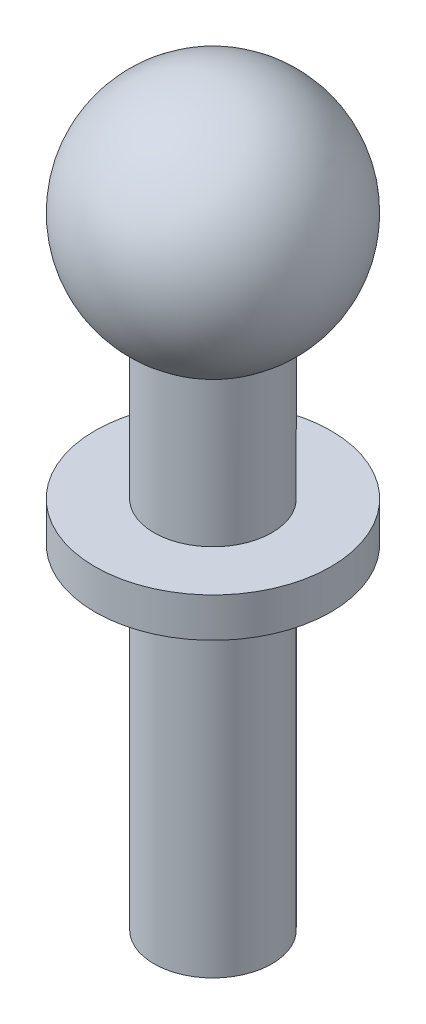
ISO-10303-21;
HEADER;
FILE_DESCRIPTION(('STEP AP214'),'2;1');
FILE_NAME('part.step','',(''),(''),'','','');
FILE_SCHEMA(('AUTOMOTIVE_DESIGN { 1 0 10303 214 1 1 1 1 }'));
ENDSEC;
DATA;
#1=APPLICATION_CONTEXT('core data for automotive mechanical design processes');
#2=APPLICATION_PROTOCOL_DEFINITION('international standard','automotive_design',2000,#1);
#3=PRODUCT_CONTEXT('',#1,'mechanical');
#4=PRODUCT('Part','Part','',(#3));
#5=PRODUCT_RELATED_PRODUCT_CATEGORY('part','',(#4));
#6=PRODUCT_DEFINITION_FORMATION('','',#4);
#7=PRODUCT_DEFINITION_CONTEXT('part definition',#1,'design');
#8=PRODUCT_DEFINITION('design','',#6,#7);
#9=PRODUCT_DEFINITION_SHAPE('','',#8);
#10=(LENGTH_UNIT() NAMED_UNIT(*) SI_UNIT(.MILLI.,.METRE.));
#11=(NAMED_UNIT(*) PLANE_ANGLE_UNIT() SI_UNIT($,.RADIAN.));
#12=(NAMED_UNIT(*) SI_UNIT($,.STERADIAN.) SOLID_ANGLE_UNIT());
#13=UNCERTAINTY_MEASURE_WITH_UNIT(LENGTH_MEASURE(1.E-05),#10,'distance_accuracy_value','');
#14=(GEOMETRIC_REPRESENTATION_CONTEXT(3) GLOBAL_UNCERTAINTY_ASSIGNED_CONTEXT((#13)) GLOBAL_UNIT_ASSIGNED_CONTEXT((#10,
#11,#12)) REPRESENTATION_CONTEXT('',''));
#15=CARTESIAN_POINT('',(0.,0.,0.));
#16=DIRECTION('',(0.,0.,1.));
#17=DIRECTION('',(1.,0.,0.));
#18=AXIS2_PLACEMENT_3D('',#15,#16,#17);
#19=CARTESIAN_POINT('',(-23.3826859021798,-105.8,-19.));
#20=DIRECTION('',(0.,-1.,0.));
#21=DIRECTION('',(0.,0.,-1.));
#22=AXIS2_PLACEMENT_3D('',#19,#20,#21);
#23=PLANE('',#22);
#24=CARTESIAN_POINT('',(-23.3826859021798,-105.8,-19.));
#25=DIRECTION('',(0.,-1.,0.));
#26=DIRECTION('',(0.,0.,-1.));
#27=AXIS2_PLACEMENT_3D('',#24,#25,#26);
#28=CIRCLE('',#27,1.5);
#29=CARTESIAN_POINT('',(-23.3826859021798,-105.8,-20.5));
#30=VERTEX_POINT('',#29);
#31=EDGE_CURVE('E125',#30,#30,#28,.T.);
#32=ORIENTED_EDGE('',*,*,#31,.T.);
#33=EDGE_LOOP('',(#32));
#34=FACE_BOUND('',#33,.T.);
#35=DIRECTION('',(1.,0.,0.));
#36=VECTOR('',#35,1.);
#37=CARTESIAN_POINT('',(-23.3826859021798,-105.8,-18.25));
#38=LINE('',#37,#36);
#39=CARTESIAN_POINT('',(-23.8156986040721,-105.8,-18.25));
#40=VERTEX_POINT('',#39);
#41=CARTESIAN_POINT('',(-22.9496732002876,-105.8,-18.25));
#42=VERTEX_POINT('',#41);
#43=EDGE_CURVE('E133',#40,#42,#38,.T.);
#44=ORIENTED_EDGE('',*,*,#43,.T.);
#45=DIRECTION('',(0.499999999999998,0.,-0.86602540378444));
#46=VECTOR('',#45,1.);
#47=CARTESIAN_POINT('',(-22.7331668493415,-105.8,-18.625));
#48=LINE('',#47,#46);
#49=CARTESIAN_POINT('',(-22.5166604983954,-105.8,-19.));
#50=VERTEX_POINT('',#49);
#51=EDGE_CURVE('E11',#42,#50,#48,.T.);
#52=ORIENTED_EDGE('',*,*,#51,.T.);
#53=DIRECTION('',(-0.499999999999998,0.,-0.86602540378444));
#54=VECTOR('',#53,1.);
#55=CARTESIAN_POINT('',(-22.7331668493415,-105.8,-19.375));
#56=LINE('',#55,#54);
#57=CARTESIAN_POINT('',(-22.9496732002876,-105.8,-19.75));
#58=VERTEX_POINT('',#57);
#59=EDGE_CURVE('E47',#50,#58,#56,.T.);
#60=ORIENTED_EDGE('',*,*,#59,.T.);
#61=DIRECTION('',(-1.,0.,0.));
#62=VECTOR('',#61,1.);
#63=CARTESIAN_POINT('',(-23.3826859021798,-105.8,-19.75));
#64=LINE('',#63,#62);
#65=CARTESIAN_POINT('',(-23.8156986040721,-105.8,-19.75));
#66=VERTEX_POINT('',#65);
#67=EDGE_CURVE('E142',#58,#66,#64,.T.);
#68=ORIENTED_EDGE('',*,*,#67,.T.);
#69=DIRECTION('',(-0.499999999999996,0.,0.866025403784441));
#70=VECTOR('',#69,1.);
#71=CARTESIAN_POINT('',(-24.0322049550182,-105.8,-19.375));
#72=LINE('',#71,#70);
#73=CARTESIAN_POINT('',(-24.2487113059643,-105.8,-19.));
#74=VERTEX_POINT('',#73);
#75=EDGE_CURVE('E137',#66,#74,#72,.T.);
#76=ORIENTED_EDGE('',*,*,#75,.T.);
#77=DIRECTION('',(0.499999999999996,0.,0.866025403784441));
#78=VECTOR('',#77,1.);
#79=CARTESIAN_POINT('',(-24.0322049550182,-105.8,-18.625));
#80=LINE('',#79,#78);
#81=EDGE_CURVE('E136',#74,#40,#80,.T.);
#82=ORIENTED_EDGE('',*,*,#81,.T.);
#83=EDGE_LOOP('',(#44,#52,#60,#68,#76,#82));
#84=FACE_BOUND('',#83,.T.);
#85=ADVANCED_FACE('F41',(#34,#84),#23,.T.);
#86=CARTESIAN_POINT('',(-23.3826859021798,-105.8,-19.));
#87=DIRECTION('',(0.,1.,0.));
#88=DIRECTION('',(0.,0.,1.));
#89=AXIS2_PLACEMENT_3D('',#86,#87,#88);
#90=CYLINDRICAL_SURFACE('',#89,1.5);
#91=CARTESIAN_POINT('',(-23.3826859021798,-97.3,-19.));
#92=DIRECTION('',(0.,-1.,0.));
#93=DIRECTION('',(0.,0.,-1.));
#94=AXIS2_PLACEMENT_3D('',#91,#92,#93);
#95=CIRCLE('',#94,1.5);
#96=CARTESIAN_POINT('',(-23.3826859021798,-97.3,-20.5));
#97=VERTEX_POINT('',#96);
#98=EDGE_CURVE('E119',#97,#97,#95,.T.);
#99=ORIENTED_EDGE('',*,*,#98,.T.);
#100=EDGE_LOOP('',(#99));
#101=FACE_BOUND('',#100,.T.);
#102=ORIENTED_EDGE('',*,*,#31,.F.);
#103=EDGE_LOOP('',(#102));
#104=FACE_BOUND('',#103,.T.);
#105=ADVANCED_FACE('F43',(#101,#104),#90,.T.);
#106=CARTESIAN_POINT('',(-23.3826859021798,-97.3,-19.));
#107=DIRECTION('',(0.,1.,0.));
#108=DIRECTION('',(0.,0.,1.));
#109=AXIS2_PLACEMENT_3D('',#106,#107,#108);
#110=CYLINDRICAL_SURFACE('',#109,3.);
#111=CARTESIAN_POINT('',(-23.3826859021798,-97.3,-19.));
#112=DIRECTION('',(0.,-1.,0.));
#113=DIRECTION('',(0.,0.,-1.));
#114=AXIS2_PLACEMENT_3D('',#111,#112,#113);
#115=CIRCLE('',#114,3.);
#116=CARTESIAN_POINT('',(-23.3826859021798,-97.3,-22.));
#117=VERTEX_POINT('',#116);
#118=EDGE_CURVE('E114',#117,#117,#115,.T.);
#119=ORIENTED_EDGE('',*,*,#118,.F.);
#120=EDGE_LOOP('',(#119));
#121=FACE_BOUND('',#120,.T.);
#122=CARTESIAN_POINT('',(-23.3826859021798,-96.3,-19.));
#123=DIRECTION('',(0.,-1.,0.));
#124=DIRECTION('',(0.,0.,-1.));
#125=AXIS2_PLACEMENT_3D('',#122,#123,#124);
#126=CIRCLE('',#125,3.);
#127=CARTESIAN_POINT('',(-23.3826859021798,-96.3,-22.));
#128=VERTEX_POINT('',#127);
#129=EDGE_CURVE('E108',#128,#128,#126,.T.);
#130=ORIENTED_EDGE('',*,*,#129,.T.);
#131=EDGE_LOOP('',(#130));
#132=FACE_BOUND('',#131,.T.);
#133=ADVANCED_FACE('F188',(#121,#132),#110,.T.);
#134=CARTESIAN_POINT('',(-23.3826859021798,-97.3,-19.));
#135=DIRECTION('',(0.,-1.,0.));
#136=DIRECTION('',(0.,0.,-1.));
#137=AXIS2_PLACEMENT_3D('',#134,#135,#136);
#138=PLANE('',#137);
#139=ORIENTED_EDGE('',*,*,#98,.F.);
#140=EDGE_LOOP('',(#139));
#141=FACE_BOUND('',#140,.T.);
#142=ORIENTED_EDGE('',*,*,#118,.T.);
#143=EDGE_LOOP('',(#142));
#144=FACE_BOUND('',#143,.T.);
#145=ADVANCED_FACE('F197',(#141,#144),#138,.T.);
#146=CARTESIAN_POINT('',(-23.3826859021798,-96.3,-19.));
#147=DIRECTION('',(0.,-1.,0.));
#148=DIRECTION('',(0.,0.,-1.));
#149=AXIS2_PLACEMENT_3D('',#146,#147,#148);
#150=PLANE('',#149);
#151=CARTESIAN_POINT('',(-23.3826859021798,-96.3,-19.));
#152=DIRECTION('',(0.,-1.,0.));
#153=DIRECTION('',(0.,0.,-1.));
#154=AXIS2_PLACEMENT_3D('',#151,#152,#153);
#155=CIRCLE('',#154,1.5);
#156=CARTESIAN_POINT('',(-23.3826859021798,-96.3,-20.5));
#157=VERTEX_POINT('',#156);
#158=EDGE_CURVE('E124',#157,#157,#155,.T.);
#159=ORIENTED_EDGE('',*,*,#158,.T.);
#160=EDGE_LOOP('',(#159));
#161=FACE_BOUND('',#160,.T.);
#162=ORIENTED_EDGE('',*,*,#129,.F.);
#163=EDGE_LOOP('',(#162));
#164=FACE_BOUND('',#163,.T.);
#165=ADVANCED_FACE('F193',(#161,#164),#150,.F.);
#166=CARTESIAN_POINT('',(-23.3826859021798,-90.,-19.));
#167=DIRECTION('',(0.,0.,-1.));
#168=DIRECTION('',(-1.,0.,0.));
#169=AXIS2_PLACEMENT_3D('',#166,#167,#168);
#170=SPHERICAL_SURFACE('',#169,3.);
#171=CARTESIAN_POINT('',(-23.3826859021798,-90.,-19.));
#172=DIRECTION('',(0.,1.,0.));
#173=DIRECTION('',(0.,0.,1.));
#174=AXIS2_PLACEMENT_3D('',#171,#172,#173);
#175=SPHERICAL_SURFACE('',#174,3.);
#176=CARTESIAN_POINT('',(-23.3826859021798,-92.5980762113533,-19.));
#177=DIRECTION('',(0.,1.,0.));
#178=DIRECTION('',(0.,0.,1.));
#179=AXIS2_PLACEMENT_3D('',#176,#177,#178);
#180=CIRCLE('',#179,1.5);
#181=CARTESIAN_POINT('',(-23.3826859021798,-92.5980762113533,-17.5));
#182=VERTEX_POINT('',#181);
#183=EDGE_CURVE('E127',#182,#182,#180,.F.);
#184=ORIENTED_EDGE('',*,*,#183,.F.);
#185=EDGE_LOOP('',(#184));
#186=FACE_BOUND('',#185,.T.);
#187=ADVANCED_FACE('F189',(#186),#175,.T.);
#188=ORIENTED_EDGE('',*,*,#183,.T.);
#189=EDGE_LOOP('',(#188));
#190=FACE_BOUND('',#189,.T.);
#191=ORIENTED_EDGE('',*,*,#158,.F.);
#192=EDGE_LOOP('',(#191));
#193=FACE_BOUND('',#192,.T.);
#194=ADVANCED_FACE('F186',(#190,#193),#90,.T.);
#195=CARTESIAN_POINT('',(-22.9496732002876,-104.3,-18.25));
#196=DIRECTION('',(-0.86602540378444,0.,-0.499999999999998));
#197=DIRECTION('',(-0.499999999999998,0.,0.86602540378444));
#198=AXIS2_PLACEMENT_3D('',#195,#196,#197);
#199=PLANE('',#198);
#200=DIRECTION('',(0.,-1.,0.));
#201=VECTOR('',#200,1.);
#202=CARTESIAN_POINT('',(-22.9496732002876,-104.3,-18.25));
#203=LINE('',#202,#201);
#204=CARTESIAN_POINT('',(-22.9496732002876,-104.3,-18.25));
#205=VERTEX_POINT('',#204);
#206=EDGE_CURVE('E57',#205,#42,#203,.T.);
#207=ORIENTED_EDGE('',*,*,#206,.F.);
#208=DIRECTION('',(0.499999999999998,0.,-0.866025403784439));
#209=VECTOR('',#208,1.);
#210=CARTESIAN_POINT('',(-22.9496732002876,-104.3,-18.25));
#211=LINE('',#210,#209);
#212=CARTESIAN_POINT('',(-22.5166604983954,-104.3,-19.));
#213=VERTEX_POINT('',#212);
#214=EDGE_CURVE('E97',#205,#213,#211,.T.);
#215=ORIENTED_EDGE('',*,*,#214,.T.);
#216=DIRECTION('',(0.,-1.,0.));
#217=VECTOR('',#216,1.);
#218=CARTESIAN_POINT('',(-22.5166604983954,-104.3,-19.));
#219=LINE('',#218,#217);
#220=EDGE_CURVE('E106',#213,#50,#219,.T.);
#221=ORIENTED_EDGE('',*,*,#220,.T.);
#222=ORIENTED_EDGE('',*,*,#51,.F.);
#223=EDGE_LOOP('',(#207,#215,#221,#222));
#224=FACE_BOUND('',#223,.T.);
#225=ADVANCED_FACE('F104',(#224),#199,.T.);
#226=CARTESIAN_POINT('',(-22.5166604983954,-104.3,-19.));
#227=DIRECTION('',(-0.86602540378444,0.,0.499999999999998));
#228=DIRECTION('',(0.499999999999998,0.,0.86602540378444));
#229=AXIS2_PLACEMENT_3D('',#226,#227,#228);
#230=PLANE('',#229);
#231=ORIENTED_EDGE('',*,*,#220,.F.);
#232=DIRECTION('',(-0.499999999999998,0.,-0.866025403784439));
#233=VECTOR('',#232,1.);
#234=CARTESIAN_POINT('',(-22.5166604983954,-104.3,-19.));
#235=LINE('',#234,#233);
#236=CARTESIAN_POINT('',(-22.9496732002876,-104.3,-19.75));
#237=VERTEX_POINT('',#236);
#238=EDGE_CURVE('E92',#213,#237,#235,.T.);
#239=ORIENTED_EDGE('',*,*,#238,.T.);
#240=DIRECTION('',(0.,-1.,0.));
#241=VECTOR('',#240,1.);
#242=CARTESIAN_POINT('',(-22.9496732002876,-104.3,-19.75));
#243=LINE('',#242,#241);
#244=EDGE_CURVE('E109',#237,#58,#243,.T.);
#245=ORIENTED_EDGE('',*,*,#244,.T.);
#246=ORIENTED_EDGE('',*,*,#59,.F.);
#247=EDGE_LOOP('',(#231,#239,#245,#246));
#248=FACE_BOUND('',#247,.T.);
#249=ADVANCED_FACE('F107',(#248),#230,.T.);
#250=CARTESIAN_POINT('',(-22.9496732002876,-104.3,-19.75));
#251=DIRECTION('',(0.,0.,1.));
#252=DIRECTION('',(1.,0.,0.));
#253=AXIS2_PLACEMENT_3D('',#250,#251,#252);
#254=PLANE('',#253);
#255=ORIENTED_EDGE('',*,*,#244,.F.);
#256=DIRECTION('',(-1.,0.,0.));
#257=VECTOR('',#256,1.);
#258=CARTESIAN_POINT('',(-22.9496732002876,-104.3,-19.75));
#259=LINE('',#258,#257);
#260=CARTESIAN_POINT('',(-23.8156986040721,-104.3,-19.75));
#261=VERTEX_POINT('',#260);
#262=EDGE_CURVE('E101',#237,#261,#259,.T.);
#263=ORIENTED_EDGE('',*,*,#262,.T.);
#264=DIRECTION('',(0.,-1.,0.));
#265=VECTOR('',#264,1.);
#266=CARTESIAN_POINT('',(-23.8156986040721,-104.3,-19.75));
#267=LINE('',#266,#265);
#268=EDGE_CURVE('E113',#261,#66,#267,.T.);
#269=ORIENTED_EDGE('',*,*,#268,.T.);
#270=ORIENTED_EDGE('',*,*,#67,.F.);
#271=EDGE_LOOP('',(#255,#263,#269,#270));
#272=FACE_BOUND('',#271,.T.);
#273=ADVANCED_FACE('F163',(#272),#254,.T.);
#274=CARTESIAN_POINT('',(-23.8156986040721,-104.3,-19.75));
#275=DIRECTION('',(0.866025403784441,0.,0.499999999999995));
#276=DIRECTION('',(0.499999999999996,0.,-0.866025403784441));
#277=AXIS2_PLACEMENT_3D('',#274,#275,#276);
#278=PLANE('',#277);
#279=ORIENTED_EDGE('',*,*,#268,.F.);
#280=DIRECTION('',(-0.499999999999996,0.,0.866025403784441));
#281=VECTOR('',#280,1.);
#282=CARTESIAN_POINT('',(-23.8156986040721,-104.3,-19.75));
#283=LINE('',#282,#281);
#284=CARTESIAN_POINT('',(-24.2487113059643,-104.3,-19.));
#285=VERTEX_POINT('',#284);
#286=EDGE_CURVE('E170',#261,#285,#283,.T.);
#287=ORIENTED_EDGE('',*,*,#286,.T.);
#288=DIRECTION('',(0.,-1.,0.));
#289=VECTOR('',#288,1.);
#290=CARTESIAN_POINT('',(-24.2487113059643,-104.3,-19.));
#291=LINE('',#290,#289);
#292=EDGE_CURVE('E154',#285,#74,#291,.T.);
#293=ORIENTED_EDGE('',*,*,#292,.T.);
#294=ORIENTED_EDGE('',*,*,#75,.F.);
#295=EDGE_LOOP('',(#279,#287,#293,#294));
#296=FACE_BOUND('',#295,.T.);
#297=ADVANCED_FACE('F167',(#296),#278,.T.);
#298=CARTESIAN_POINT('',(-24.2487113059643,-104.3,-19.));
#299=DIRECTION('',(0.866025403784441,0.,-0.499999999999995));
#300=DIRECTION('',(-0.499999999999996,0.,-0.866025403784441));
#301=AXIS2_PLACEMENT_3D('',#298,#299,#300);
#302=PLANE('',#301);
#303=ORIENTED_EDGE('',*,*,#292,.F.);
#304=DIRECTION('',(0.499999999999996,0.,0.866025403784441));
#305=VECTOR('',#304,1.);
#306=CARTESIAN_POINT('',(-24.2487113059643,-104.3,-19.));
#307=LINE('',#306,#305);
#308=CARTESIAN_POINT('',(-23.8156986040721,-104.3,-18.25));
#309=VERTEX_POINT('',#308);
#310=EDGE_CURVE('E152',#285,#309,#307,.T.);
#311=ORIENTED_EDGE('',*,*,#310,.T.);
#312=DIRECTION('',(0.,-1.,0.));
#313=VECTOR('',#312,1.);
#314=CARTESIAN_POINT('',(-23.8156986040721,-104.3,-18.25));
#315=LINE('',#314,#313);
#316=EDGE_CURVE('E146',#309,#40,#315,.T.);
#317=ORIENTED_EDGE('',*,*,#316,.T.);
#318=ORIENTED_EDGE('',*,*,#81,.F.);
#319=EDGE_LOOP('',(#303,#311,#317,#318));
#320=FACE_BOUND('',#319,.T.);
#321=ADVANCED_FACE('F151',(#320),#302,.T.);
#322=CARTESIAN_POINT('',(-23.8156986040721,-104.3,-18.25));
#323=DIRECTION('',(0.,0.,-1.));
#324=DIRECTION('',(-1.,0.,0.));
#325=AXIS2_PLACEMENT_3D('',#322,#323,#324);
#326=PLANE('',#325);
#327=ORIENTED_EDGE('',*,*,#316,.F.);
#328=DIRECTION('',(1.,0.,0.));
#329=VECTOR('',#328,1.);
#330=CARTESIAN_POINT('',(-23.8156986040721,-104.3,-18.25));
#331=LINE('',#330,#329);
#332=EDGE_CURVE('E158',#309,#205,#331,.T.);
#333=ORIENTED_EDGE('',*,*,#332,.T.);
#334=ORIENTED_EDGE('',*,*,#206,.T.);
#335=ORIENTED_EDGE('',*,*,#43,.F.);
#336=EDGE_LOOP('',(#327,#333,#334,#335));
#337=FACE_BOUND('',#336,.T.);
#338=ADVANCED_FACE('F150',(#337),#326,.T.);
#339=CARTESIAN_POINT('',(0.,-104.3,0.));
#340=DIRECTION('',(0.,1.,0.));
#341=DIRECTION('',(0.,0.,1.));
#342=AXIS2_PLACEMENT_3D('',#339,#340,#341);
#343=PLANE('',#342);
#344=ORIENTED_EDGE('',*,*,#214,.F.);
#345=ORIENTED_EDGE('',*,*,#332,.F.);
#346=ORIENTED_EDGE('',*,*,#310,.F.);
#347=ORIENTED_EDGE('',*,*,#286,.F.);
#348=ORIENTED_EDGE('',*,*,#262,.F.);
#349=ORIENTED_EDGE('',*,*,#238,.F.);
#350=EDGE_LOOP('',(#344,#345,#346,#347,#348,#349));
#351=FACE_BOUND('',#350,.T.);
#352=ADVANCED_FACE('F100',(#351),#343,.F.);
#353=CLOSED_SHELL('',(#85,#105,#133,#145,#165,#187,#194,#225,#249,#273,#297,#321,#338,#352));
#354=MANIFOLD_SOLID_BREP('B2',#353);
#355=ADVANCED_BREP_SHAPE_REPRESENTATION('',(#18,#354),#14);
#356=SHAPE_DEFINITION_REPRESENTATION(#9,#355);
ENDSEC;
END-ISO-10303-21;
